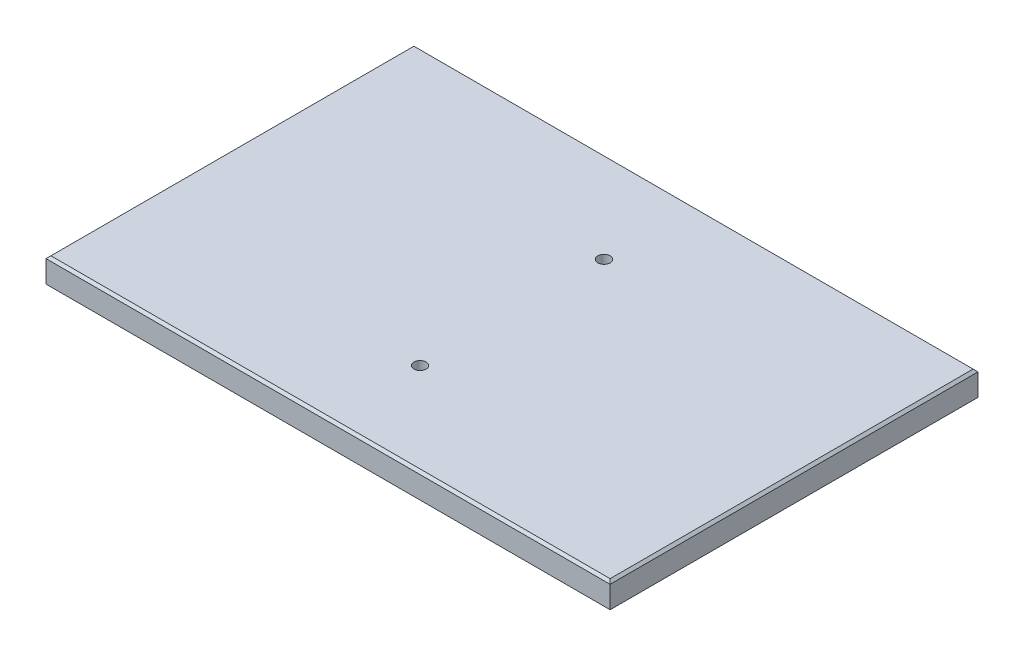
ISO-10303-21;
HEADER;
FILE_DESCRIPTION(('STEP AP214'),'2;1');
FILE_NAME('part.step','',(''),(''),'','','');
FILE_SCHEMA(('AUTOMOTIVE_DESIGN { 1 0 10303 214 1 1 1 1 }'));
ENDSEC;
DATA;
#1=APPLICATION_CONTEXT('core data for automotive mechanical design processes');
#2=APPLICATION_PROTOCOL_DEFINITION('international standard','automotive_design',2000,#1);
#3=PRODUCT_CONTEXT('',#1,'mechanical');
#4=PRODUCT('Part','Part','',(#3));
#5=PRODUCT_RELATED_PRODUCT_CATEGORY('part','',(#4));
#6=PRODUCT_DEFINITION_FORMATION('','',#4);
#7=PRODUCT_DEFINITION_CONTEXT('part definition',#1,'design');
#8=PRODUCT_DEFINITION('design','',#6,#7);
#9=PRODUCT_DEFINITION_SHAPE('','',#8);
#10=(LENGTH_UNIT() NAMED_UNIT(*) SI_UNIT(.MILLI.,.METRE.));
#11=(NAMED_UNIT(*) PLANE_ANGLE_UNIT() SI_UNIT($,.RADIAN.));
#12=(NAMED_UNIT(*) SI_UNIT($,.STERADIAN.) SOLID_ANGLE_UNIT());
#13=UNCERTAINTY_MEASURE_WITH_UNIT(LENGTH_MEASURE(1.E-05),#10,'distance_accuracy_value','');
#14=(GEOMETRIC_REPRESENTATION_CONTEXT(3) GLOBAL_UNCERTAINTY_ASSIGNED_CONTEXT((#13)) GLOBAL_UNIT_ASSIGNED_CONTEXT((#10,
#11,#12)) REPRESENTATION_CONTEXT('',''));
#15=CARTESIAN_POINT('',(0.,0.,0.));
#16=DIRECTION('',(0.,0.,1.));
#17=DIRECTION('',(1.,0.,0.));
#18=AXIS2_PLACEMENT_3D('',#15,#16,#17);
#19=CARTESIAN_POINT('',(115.,-10.,75.));
#20=DIRECTION('',(1.,0.,0.));
#21=DIRECTION('',(0.,0.,-1.));
#22=AXIS2_PLACEMENT_3D('',#19,#20,#21);
#23=PLANE('',#22);
#24=DIRECTION('',(0.,1.,0.));
#25=VECTOR('',#24,1.);
#26=CARTESIAN_POINT('',(115.,-10.,-75.));
#27=LINE('',#26,#25);
#28=CARTESIAN_POINT('',(115.,-10.,-75.));
#29=VERTEX_POINT('',#28);
#30=CARTESIAN_POINT('',(115.,-0.999999999999973,-75.));
#31=VERTEX_POINT('',#30);
#32=EDGE_CURVE('E90',#29,#31,#27,.T.);
#33=ORIENTED_EDGE('',*,*,#32,.T.);
#34=DIRECTION('',(0.,0.,1.));
#35=VECTOR('',#34,1.);
#36=CARTESIAN_POINT('',(115.,-0.999999999999973,75.));
#37=LINE('',#36,#35);
#38=CARTESIAN_POINT('',(115.,-0.999999999999973,75.));
#39=VERTEX_POINT('',#38);
#40=EDGE_CURVE('E136',#31,#39,#37,.T.);
#41=ORIENTED_EDGE('',*,*,#40,.T.);
#42=DIRECTION('',(0.,1.,0.));
#43=VECTOR('',#42,1.);
#44=CARTESIAN_POINT('',(115.,-10.,75.));
#45=LINE('',#44,#43);
#46=CARTESIAN_POINT('',(115.,-10.,75.));
#47=VERTEX_POINT('',#46);
#48=EDGE_CURVE('E113',#47,#39,#45,.T.);
#49=ORIENTED_EDGE('',*,*,#48,.F.);
#50=DIRECTION('',(0.,0.,-1.));
#51=VECTOR('',#50,1.);
#52=CARTESIAN_POINT('',(115.,-10.,75.));
#53=LINE('',#52,#51);
#54=EDGE_CURVE('E108',#47,#29,#53,.T.);
#55=ORIENTED_EDGE('',*,*,#54,.T.);
#56=EDGE_LOOP('',(#33,#41,#49,#55));
#57=FACE_BOUND('',#56,.T.);
#58=ADVANCED_FACE('F37',(#57),#23,.T.);
#59=CARTESIAN_POINT('',(115.,-10.,75.));
#60=DIRECTION('',(0.,0.,1.));
#61=DIRECTION('',(1.,0.,0.));
#62=AXIS2_PLACEMENT_3D('',#59,#60,#61);
#63=PLANE('',#62);
#64=ORIENTED_EDGE('',*,*,#48,.T.);
#65=DIRECTION('',(-1.,0.,0.));
#66=VECTOR('',#65,1.);
#67=CARTESIAN_POINT('',(115.,-0.999999999999973,75.));
#68=LINE('',#67,#66);
#69=CARTESIAN_POINT('',(-115.,-0.999999999999973,75.));
#70=VERTEX_POINT('',#69);
#71=EDGE_CURVE('E11',#39,#70,#68,.T.);
#72=ORIENTED_EDGE('',*,*,#71,.T.);
#73=DIRECTION('',(0.,1.,0.));
#74=VECTOR('',#73,1.);
#75=CARTESIAN_POINT('',(-115.,-10.,75.));
#76=LINE('',#75,#74);
#77=CARTESIAN_POINT('',(-115.,-10.,75.));
#78=VERTEX_POINT('',#77);
#79=EDGE_CURVE('E125',#78,#70,#76,.T.);
#80=ORIENTED_EDGE('',*,*,#79,.F.);
#81=DIRECTION('',(1.,0.,0.));
#82=VECTOR('',#81,1.);
#83=CARTESIAN_POINT('',(115.,-10.,75.));
#84=LINE('',#83,#82);
#85=EDGE_CURVE('E101',#78,#47,#84,.T.);
#86=ORIENTED_EDGE('',*,*,#85,.T.);
#87=EDGE_LOOP('',(#64,#72,#80,#86));
#88=FACE_BOUND('',#87,.T.);
#89=ADVANCED_FACE('F159',(#88),#63,.T.);
#90=CARTESIAN_POINT('',(-115.,-10.,75.));
#91=DIRECTION('',(-1.,0.,0.));
#92=DIRECTION('',(0.,0.,1.));
#93=AXIS2_PLACEMENT_3D('',#90,#91,#92);
#94=PLANE('',#93);
#95=ORIENTED_EDGE('',*,*,#79,.T.);
#96=DIRECTION('',(0.,0.,-1.));
#97=VECTOR('',#96,1.);
#98=CARTESIAN_POINT('',(-115.,-0.999999999999973,75.));
#99=LINE('',#98,#97);
#100=CARTESIAN_POINT('',(-115.,-0.999999999999973,-75.));
#101=VERTEX_POINT('',#100);
#102=EDGE_CURVE('E46',#70,#101,#99,.T.);
#103=ORIENTED_EDGE('',*,*,#102,.T.);
#104=DIRECTION('',(0.,1.,0.));
#105=VECTOR('',#104,1.);
#106=CARTESIAN_POINT('',(-115.,-10.,-75.));
#107=LINE('',#106,#105);
#108=CARTESIAN_POINT('',(-115.,-10.,-75.));
#109=VERTEX_POINT('',#108);
#110=EDGE_CURVE('E100',#109,#101,#107,.T.);
#111=ORIENTED_EDGE('',*,*,#110,.F.);
#112=DIRECTION('',(0.,0.,1.));
#113=VECTOR('',#112,1.);
#114=CARTESIAN_POINT('',(-115.,-10.,75.));
#115=LINE('',#114,#113);
#116=EDGE_CURVE('E111',#109,#78,#115,.T.);
#117=ORIENTED_EDGE('',*,*,#116,.T.);
#118=EDGE_LOOP('',(#95,#103,#111,#117));
#119=FACE_BOUND('',#118,.T.);
#120=ADVANCED_FACE('F160',(#119),#94,.T.);
#121=CARTESIAN_POINT('',(115.,-10.,-75.));
#122=DIRECTION('',(0.,0.,-1.));
#123=DIRECTION('',(-1.,0.,0.));
#124=AXIS2_PLACEMENT_3D('',#121,#122,#123);
#125=PLANE('',#124);
#126=ORIENTED_EDGE('',*,*,#110,.T.);
#127=DIRECTION('',(1.,0.,0.));
#128=VECTOR('',#127,1.);
#129=CARTESIAN_POINT('',(115.,-0.999999999999973,-75.));
#130=LINE('',#129,#128);
#131=EDGE_CURVE('E95',#101,#31,#130,.T.);
#132=ORIENTED_EDGE('',*,*,#131,.T.);
#133=ORIENTED_EDGE('',*,*,#32,.F.);
#134=DIRECTION('',(-1.,0.,0.));
#135=VECTOR('',#134,1.);
#136=CARTESIAN_POINT('',(115.,-10.,-75.));
#137=LINE('',#136,#135);
#138=EDGE_CURVE('E93',#29,#109,#137,.T.);
#139=ORIENTED_EDGE('',*,*,#138,.T.);
#140=EDGE_LOOP('',(#126,#132,#133,#139));
#141=FACE_BOUND('',#140,.T.);
#142=ADVANCED_FACE('F92',(#141),#125,.T.);
#143=CARTESIAN_POINT('',(115.,-10.,-75.));
#144=DIRECTION('',(0.,1.,0.));
#145=DIRECTION('',(0.,0.,1.));
#146=AXIS2_PLACEMENT_3D('',#143,#144,#145);
#147=PLANE('',#146);
#148=CARTESIAN_POINT('',(0.,-10.,37.5));
#149=DIRECTION('',(0.,1.,0.));
#150=DIRECTION('',(0.,0.,1.));
#151=AXIS2_PLACEMENT_3D('',#148,#149,#150);
#152=CIRCLE('',#151,2.5);
#153=CARTESIAN_POINT('',(0.,-10.,40.));
#154=VERTEX_POINT('',#153);
#155=EDGE_CURVE('E208',#154,#154,#152,.T.);
#156=ORIENTED_EDGE('',*,*,#155,.T.);
#157=EDGE_LOOP('',(#156));
#158=FACE_BOUND('',#157,.T.);
#159=CARTESIAN_POINT('',(0.,-10.,-37.5));
#160=DIRECTION('',(0.,1.,0.));
#161=DIRECTION('',(0.,0.,1.));
#162=AXIS2_PLACEMENT_3D('',#159,#160,#161);
#163=CIRCLE('',#162,2.5);
#164=CARTESIAN_POINT('',(0.,-10.,-35.));
#165=VERTEX_POINT('',#164);
#166=EDGE_CURVE('E118',#165,#165,#163,.T.);
#167=ORIENTED_EDGE('',*,*,#166,.T.);
#168=EDGE_LOOP('',(#167));
#169=FACE_BOUND('',#168,.T.);
#170=ORIENTED_EDGE('',*,*,#54,.F.);
#171=ORIENTED_EDGE('',*,*,#85,.F.);
#172=ORIENTED_EDGE('',*,*,#116,.F.);
#173=ORIENTED_EDGE('',*,*,#138,.F.);
#174=EDGE_LOOP('',(#170,#171,#172,#173));
#175=FACE_BOUND('',#174,.T.);
#176=ADVANCED_FACE('F106',(#158,#169,#175),#147,.F.);
#177=CARTESIAN_POINT('',(115.,0.,-75.));
#178=DIRECTION('',(0.,1.,0.));
#179=DIRECTION('',(0.,0.,1.));
#180=AXIS2_PLACEMENT_3D('',#177,#178,#179);
#181=PLANE('',#180);
#182=CARTESIAN_POINT('',(0.,0.,37.5));
#183=DIRECTION('',(0.,1.,0.));
#184=DIRECTION('',(0.,0.,1.));
#185=AXIS2_PLACEMENT_3D('',#182,#183,#184);
#186=CIRCLE('',#185,2.5);
#187=CARTESIAN_POINT('',(0.,0.,40.));
#188=VERTEX_POINT('',#187);
#189=EDGE_CURVE('E210',#188,#188,#186,.T.);
#190=ORIENTED_EDGE('',*,*,#189,.F.);
#191=EDGE_LOOP('',(#190));
#192=FACE_BOUND('',#191,.T.);
#193=CARTESIAN_POINT('',(0.,0.,-37.5));
#194=DIRECTION('',(0.,1.,0.));
#195=DIRECTION('',(0.,0.,1.));
#196=AXIS2_PLACEMENT_3D('',#193,#194,#195);
#197=CIRCLE('',#196,2.5);
#198=CARTESIAN_POINT('',(0.,0.,-35.));
#199=VERTEX_POINT('',#198);
#200=EDGE_CURVE('E212',#199,#199,#197,.T.);
#201=ORIENTED_EDGE('',*,*,#200,.F.);
#202=EDGE_LOOP('',(#201));
#203=FACE_BOUND('',#202,.T.);
#204=DIRECTION('',(1.,0.,0.));
#205=VECTOR('',#204,1.);
#206=CARTESIAN_POINT('',(115.,0.,74.));
#207=LINE('',#206,#205);
#208=CARTESIAN_POINT('',(-114.,0.,74.));
#209=VERTEX_POINT('',#208);
#210=CARTESIAN_POINT('',(114.,0.,74.));
#211=VERTEX_POINT('',#210);
#212=EDGE_CURVE('E124',#209,#211,#207,.T.);
#213=ORIENTED_EDGE('',*,*,#212,.T.);
#214=DIRECTION('',(0.,0.,-1.));
#215=VECTOR('',#214,1.);
#216=CARTESIAN_POINT('',(114.,0.,-75.));
#217=LINE('',#216,#215);
#218=CARTESIAN_POINT('',(114.,0.,-74.));
#219=VERTEX_POINT('',#218);
#220=EDGE_CURVE('E133',#211,#219,#217,.T.);
#221=ORIENTED_EDGE('',*,*,#220,.T.);
#222=DIRECTION('',(-1.,0.,0.));
#223=VECTOR('',#222,1.);
#224=CARTESIAN_POINT('',(115.,0.,-74.));
#225=LINE('',#224,#223);
#226=CARTESIAN_POINT('',(-114.,0.,-74.));
#227=VERTEX_POINT('',#226);
#228=EDGE_CURVE('E131',#219,#227,#225,.T.);
#229=ORIENTED_EDGE('',*,*,#228,.T.);
#230=DIRECTION('',(0.,0.,1.));
#231=VECTOR('',#230,1.);
#232=CARTESIAN_POINT('',(-114.,0.,-75.));
#233=LINE('',#232,#231);
#234=EDGE_CURVE('E129',#227,#209,#233,.T.);
#235=ORIENTED_EDGE('',*,*,#234,.T.);
#236=EDGE_LOOP('',(#213,#221,#229,#235));
#237=FACE_BOUND('',#236,.T.);
#238=ADVANCED_FACE('F154',(#192,#203,#237),#181,.T.);
#239=CARTESIAN_POINT('',(-114.,0.,-75.));
#240=DIRECTION('',(0.707106781186538,-0.707106781186557,0.));
#241=DIRECTION('',(0.707106781186557,0.707106781186538,0.));
#242=AXIS2_PLACEMENT_3D('',#239,#240,#241);
#243=PLANE('',#242);
#244=DIRECTION('',(-0.577350269189631,-0.577350269189615,-0.577350269189631));
#245=VECTOR('',#244,1.);
#246=CARTESIAN_POINT('',(-114.333333333333,-0.33333333333334,-74.3333333333333));
#247=LINE('',#246,#245);
#248=EDGE_CURVE('E116',#101,#227,#247,.F.);
#249=ORIENTED_EDGE('',*,*,#248,.F.);
#250=ORIENTED_EDGE('',*,*,#102,.F.);
#251=DIRECTION('',(-0.577350269189631,-0.577350269189615,0.577350269189631));
#252=VECTOR('',#251,1.);
#253=CARTESIAN_POINT('',(-37.6666666666653,76.3333333333326,-2.33333333333474));
#254=LINE('',#253,#252);
#255=EDGE_CURVE('E41',#209,#70,#254,.T.);
#256=ORIENTED_EDGE('',*,*,#255,.F.);
#257=ORIENTED_EDGE('',*,*,#234,.F.);
#258=EDGE_LOOP('',(#249,#250,#256,#257));
#259=FACE_BOUND('',#258,.T.);
#260=ADVANCED_FACE('F39',(#259),#243,.F.);
#261=CARTESIAN_POINT('',(115.,0.,74.));
#262=DIRECTION('',(0.,-0.707106781186557,-0.707106781186538));
#263=DIRECTION('',(0.,0.707106781186538,-0.707106781186557));
#264=AXIS2_PLACEMENT_3D('',#261,#262,#263);
#265=PLANE('',#264);
#266=ORIENTED_EDGE('',*,*,#255,.T.);
#267=ORIENTED_EDGE('',*,*,#71,.F.);
#268=DIRECTION('',(-0.577350269189631,0.577350269189615,-0.577350269189631));
#269=VECTOR('',#268,1.);
#270=CARTESIAN_POINT('',(114.333333333333,-0.333333333333335,74.3333333333333));
#271=LINE('',#270,#269);
#272=EDGE_CURVE('E142',#211,#39,#271,.F.);
#273=ORIENTED_EDGE('',*,*,#272,.F.);
#274=ORIENTED_EDGE('',*,*,#212,.F.);
#275=EDGE_LOOP('',(#266,#267,#273,#274));
#276=FACE_BOUND('',#275,.T.);
#277=ADVANCED_FACE('F178',(#276),#265,.F.);
#278=CARTESIAN_POINT('',(115.,0.,-74.));
#279=DIRECTION('',(0.,-0.707106781186557,0.707106781186538));
#280=DIRECTION('',(0.,-0.707106781186538,-0.707106781186557));
#281=AXIS2_PLACEMENT_3D('',#278,#279,#280);
#282=PLANE('',#281);
#283=ORIENTED_EDGE('',*,*,#248,.T.);
#284=ORIENTED_EDGE('',*,*,#228,.F.);
#285=DIRECTION('',(0.577350269189631,-0.577350269189615,-0.577350269189631));
#286=VECTOR('',#285,1.);
#287=CARTESIAN_POINT('',(114.333333333333,-0.333333333333331,-74.3333333333333));
#288=LINE('',#287,#286);
#289=EDGE_CURVE('E140',#31,#219,#288,.F.);
#290=ORIENTED_EDGE('',*,*,#289,.F.);
#291=ORIENTED_EDGE('',*,*,#131,.F.);
#292=EDGE_LOOP('',(#283,#284,#290,#291));
#293=FACE_BOUND('',#292,.T.);
#294=ADVANCED_FACE('F147',(#293),#282,.F.);
#295=CARTESIAN_POINT('',(114.,0.,-75.));
#296=DIRECTION('',(-0.707106781186538,-0.707106781186557,0.));
#297=DIRECTION('',(0.707106781186557,-0.707106781186538,0.));
#298=AXIS2_PLACEMENT_3D('',#295,#296,#297);
#299=PLANE('',#298);
#300=ORIENTED_EDGE('',*,*,#272,.T.);
#301=ORIENTED_EDGE('',*,*,#40,.F.);
#302=ORIENTED_EDGE('',*,*,#289,.T.);
#303=ORIENTED_EDGE('',*,*,#220,.F.);
#304=EDGE_LOOP('',(#300,#301,#302,#303));
#305=FACE_BOUND('',#304,.T.);
#306=ADVANCED_FACE('F158',(#305),#299,.F.);
#307=CARTESIAN_POINT('',(0.,0.,-37.5));
#308=DIRECTION('',(0.,1.,0.));
#309=DIRECTION('',(0.,0.,1.));
#310=AXIS2_PLACEMENT_3D('',#307,#308,#309);
#311=CYLINDRICAL_SURFACE('',#310,2.5);
#312=ORIENTED_EDGE('',*,*,#166,.F.);
#313=EDGE_LOOP('',(#312));
#314=FACE_BOUND('',#313,.T.);
#315=ORIENTED_EDGE('',*,*,#200,.T.);
#316=EDGE_LOOP('',(#315));
#317=FACE_BOUND('',#316,.T.);
#318=ADVANCED_FACE('F176',(#314,#317),#311,.F.);
#319=CARTESIAN_POINT('',(0.,0.,37.5));
#320=DIRECTION('',(0.,1.,0.));
#321=DIRECTION('',(0.,0.,1.));
#322=AXIS2_PLACEMENT_3D('',#319,#320,#321);
#323=CYLINDRICAL_SURFACE('',#322,2.5);
#324=ORIENTED_EDGE('',*,*,#155,.F.);
#325=EDGE_LOOP('',(#324));
#326=FACE_BOUND('',#325,.T.);
#327=ORIENTED_EDGE('',*,*,#189,.T.);
#328=EDGE_LOOP('',(#327));
#329=FACE_BOUND('',#328,.T.);
#330=ADVANCED_FACE('F199',(#326,#329),#323,.F.);
#331=CLOSED_SHELL('',(#58,#89,#120,#142,#176,#238,#260,#277,#294,#306,#318,#330));
#332=MANIFOLD_SOLID_BREP('B2',#331);
#333=ADVANCED_BREP_SHAPE_REPRESENTATION('',(#18,#332),#14);
#334=SHAPE_DEFINITION_REPRESENTATION(#9,#333);
ENDSEC;
END-ISO-10303-21;
